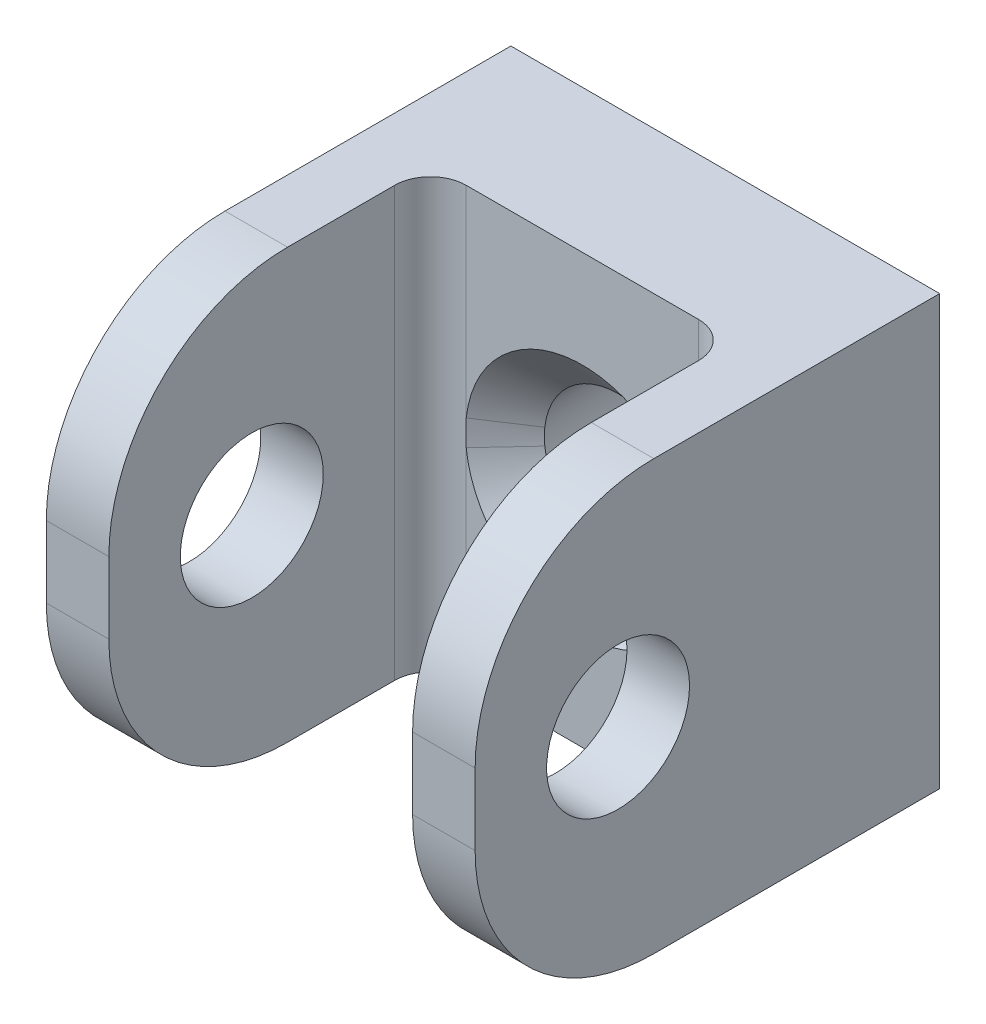
ISO-10303-21;
HEADER;
FILE_DESCRIPTION(('STEP AP214'),'2;1');
FILE_NAME('part.step','',(''),(''),'','','');
FILE_SCHEMA(('AUTOMOTIVE_DESIGN { 1 0 10303 214 1 1 1 1 }'));
ENDSEC;
DATA;
#1=APPLICATION_CONTEXT('core data for automotive mechanical design processes');
#2=APPLICATION_PROTOCOL_DEFINITION('international standard','automotive_design',2000,#1);
#3=PRODUCT_CONTEXT('',#1,'mechanical');
#4=PRODUCT('Part','Part','',(#3));
#5=PRODUCT_RELATED_PRODUCT_CATEGORY('part','',(#4));
#6=PRODUCT_DEFINITION_FORMATION('','',#4);
#7=PRODUCT_DEFINITION_CONTEXT('part definition',#1,'design');
#8=PRODUCT_DEFINITION('design','',#6,#7);
#9=PRODUCT_DEFINITION_SHAPE('','',#8);
#10=(LENGTH_UNIT() NAMED_UNIT(*) SI_UNIT(.MILLI.,.METRE.));
#11=(NAMED_UNIT(*) PLANE_ANGLE_UNIT() SI_UNIT($,.RADIAN.));
#12=(NAMED_UNIT(*) SI_UNIT($,.STERADIAN.) SOLID_ANGLE_UNIT());
#13=UNCERTAINTY_MEASURE_WITH_UNIT(LENGTH_MEASURE(1.E-05),#10,'distance_accuracy_value','');
#14=(GEOMETRIC_REPRESENTATION_CONTEXT(3) GLOBAL_UNCERTAINTY_ASSIGNED_CONTEXT((#13)) GLOBAL_UNIT_ASSIGNED_CONTEXT((#10,
#11,#12)) REPRESENTATION_CONTEXT('',''));
#15=CARTESIAN_POINT('',(0.,0.,0.));
#16=DIRECTION('',(0.,0.,1.));
#17=DIRECTION('',(1.,0.,0.));
#18=AXIS2_PLACEMENT_3D('',#15,#16,#17);
#19=CARTESIAN_POINT('',(0.,0.,-16.));
#20=DIRECTION('',(0.,0.,-1.));
#21=DIRECTION('',(-1.,0.,0.));
#22=AXIS2_PLACEMENT_3D('',#19,#20,#21);
#23=PLANE('',#22);
#24=DIRECTION('',(0.,-1.,0.));
#25=VECTOR('',#24,1.);
#26=CARTESIAN_POINT('',(3.25,6.,-16.));
#27=LINE('',#26,#25);
#28=CARTESIAN_POINT('',(3.25,-6.,-16.));
#29=VERTEX_POINT('',#28);
#30=CARTESIAN_POINT('',(3.25,-0.361109401705414,-16.));
#31=VERTEX_POINT('',#30);
#32=EDGE_CURVE('E336',#29,#31,#27,.F.);
#33=ORIENTED_EDGE('',*,*,#32,.T.);
#34=CARTESIAN_POINT('',(0.,0.,-16.));
#35=DIRECTION('',(0.,0.,-1.));
#36=DIRECTION('',(-1.,0.,0.));
#37=AXIS2_PLACEMENT_3D('',#34,#35,#36);
#38=CIRCLE('',#37,3.27000000000001);
#39=CARTESIAN_POINT('',(-3.25,-0.361109401705414,-16.));
#40=VERTEX_POINT('',#39);
#41=EDGE_CURVE('E69',#31,#40,#38,.T.);
#42=ORIENTED_EDGE('',*,*,#41,.T.);
#43=DIRECTION('',(0.,-1.,0.));
#44=VECTOR('',#43,1.);
#45=CARTESIAN_POINT('',(-3.25,-6.,-16.));
#46=LINE('',#45,#44);
#47=CARTESIAN_POINT('',(-3.25,-6.,-16.));
#48=VERTEX_POINT('',#47);
#49=EDGE_CURVE('E321',#40,#48,#46,.T.);
#50=ORIENTED_EDGE('',*,*,#49,.T.);
#51=DIRECTION('',(1.,0.,0.));
#52=VECTOR('',#51,1.);
#53=CARTESIAN_POINT('',(0.,-6.,-16.));
#54=LINE('',#53,#52);
#55=EDGE_CURVE('E275',#48,#29,#54,.T.);
#56=ORIENTED_EDGE('',*,*,#55,.T.);
#57=EDGE_LOOP('',(#33,#42,#50,#56));
#58=FACE_BOUND('',#57,.T.);
#59=ADVANCED_FACE('F47',(#58),#23,.F.);
#60=CARTESIAN_POINT('',(-3.25,6.,-16.));
#61=VERTEX_POINT('',#60);
#62=CARTESIAN_POINT('',(-3.25,0.361109401705414,-16.));
#63=VERTEX_POINT('',#62);
#64=EDGE_CURVE('E330',#61,#63,#46,.T.);
#65=ORIENTED_EDGE('',*,*,#64,.T.);
#66=CARTESIAN_POINT('',(0.,0.,-16.));
#67=DIRECTION('',(0.,0.,-1.));
#68=DIRECTION('',(-1.,0.,0.));
#69=AXIS2_PLACEMENT_3D('',#66,#67,#68);
#70=CIRCLE('',#69,3.27000000000001);
#71=CARTESIAN_POINT('',(3.25,0.361109401705414,-16.));
#72=VERTEX_POINT('',#71);
#73=EDGE_CURVE('E386',#63,#72,#70,.T.);
#74=ORIENTED_EDGE('',*,*,#73,.T.);
#75=CARTESIAN_POINT('',(3.25,6.,-16.));
#76=VERTEX_POINT('',#75);
#77=EDGE_CURVE('E333',#72,#76,#27,.F.);
#78=ORIENTED_EDGE('',*,*,#77,.T.);
#79=DIRECTION('',(-1.,0.,0.));
#80=VECTOR('',#79,1.);
#81=CARTESIAN_POINT('',(0.,6.,-16.));
#82=LINE('',#81,#80);
#83=EDGE_CURVE('E271',#76,#61,#82,.T.);
#84=ORIENTED_EDGE('',*,*,#83,.T.);
#85=EDGE_LOOP('',(#65,#74,#78,#84));
#86=FACE_BOUND('',#85,.T.);
#87=ADVANCED_FACE('F519',(#86),#23,.F.);
#88=CARTESIAN_POINT('',(6.,-6.,-16.));
#89=DIRECTION('',(-1.,0.,0.));
#90=DIRECTION('',(0.,0.,1.));
#91=AXIS2_PLACEMENT_3D('',#88,#89,#90);
#92=PLANE('',#91);
#93=CARTESIAN_POINT('',(6.,0.,-11.));
#94=DIRECTION('',(-1.,0.,0.));
#95=DIRECTION('',(0.,0.,1.));
#96=AXIS2_PLACEMENT_3D('',#93,#94,#95);
#97=CIRCLE('',#96,2.);
#98=CARTESIAN_POINT('',(6.,0.,-13.));
#99=VERTEX_POINT('',#98);
#100=EDGE_CURVE('E244',#99,#99,#97,.F.);
#101=ORIENTED_EDGE('',*,*,#100,.F.);
#102=EDGE_LOOP('',(#101));
#103=FACE_BOUND('',#102,.T.);
#104=DIRECTION('',(0.,1.,0.));
#105=VECTOR('',#104,1.);
#106=CARTESIAN_POINT('',(6.,-6.,-7.));
#107=LINE('',#106,#105);
#108=CARTESIAN_POINT('',(6.,-1.,-7.));
#109=VERTEX_POINT('',#108);
#110=CARTESIAN_POINT('',(6.,1.,-7.));
#111=VERTEX_POINT('',#110);
#112=EDGE_CURVE('E255',#109,#111,#107,.T.);
#113=ORIENTED_EDGE('',*,*,#112,.F.);
#114=CARTESIAN_POINT('',(6.,-1.,-12.));
#115=DIRECTION('',(-1.,0.,0.));
#116=DIRECTION('',(0.,0.,1.));
#117=AXIS2_PLACEMENT_3D('',#114,#115,#116);
#118=CIRCLE('',#117,5.);
#119=CARTESIAN_POINT('',(6.,-6.,-12.));
#120=VERTEX_POINT('',#119);
#121=EDGE_CURVE('E299',#109,#120,#118,.F.);
#122=ORIENTED_EDGE('',*,*,#121,.T.);
#123=DIRECTION('',(0.,0.,-1.));
#124=VECTOR('',#123,1.);
#125=CARTESIAN_POINT('',(6.,-6.,-16.));
#126=LINE('',#125,#124);
#127=CARTESIAN_POINT('',(6.,-6.,-20.));
#128=VERTEX_POINT('',#127);
#129=EDGE_CURVE('E279',#120,#128,#126,.T.);
#130=ORIENTED_EDGE('',*,*,#129,.T.);
#131=DIRECTION('',(0.,1.,0.));
#132=VECTOR('',#131,1.);
#133=CARTESIAN_POINT('',(6.,-6.,-20.));
#134=LINE('',#133,#132);
#135=CARTESIAN_POINT('',(6.,6.,-20.));
#136=VERTEX_POINT('',#135);
#137=EDGE_CURVE('E196',#128,#136,#134,.T.);
#138=ORIENTED_EDGE('',*,*,#137,.T.);
#139=DIRECTION('',(0.,0.,-1.));
#140=VECTOR('',#139,1.);
#141=CARTESIAN_POINT('',(6.,6.,-16.));
#142=LINE('',#141,#140);
#143=CARTESIAN_POINT('',(6.,6.,-12.));
#144=VERTEX_POINT('',#143);
#145=EDGE_CURVE('E190',#144,#136,#142,.T.);
#146=ORIENTED_EDGE('',*,*,#145,.F.);
#147=CARTESIAN_POINT('',(6.,1.,-12.));
#148=DIRECTION('',(-1.,0.,0.));
#149=DIRECTION('',(0.,0.,1.));
#150=AXIS2_PLACEMENT_3D('',#147,#148,#149);
#151=CIRCLE('',#150,5.);
#152=EDGE_CURVE('E296',#144,#111,#151,.F.);
#153=ORIENTED_EDGE('',*,*,#152,.T.);
#154=EDGE_LOOP('',(#113,#122,#130,#138,#146,#153));
#155=FACE_BOUND('',#154,.T.);
#156=ADVANCED_FACE('F525',(#103,#155),#92,.F.);
#157=CARTESIAN_POINT('',(0.,6.,-16.));
#158=DIRECTION('',(0.,-1.,0.));
#159=DIRECTION('',(0.,0.,-1.));
#160=AXIS2_PLACEMENT_3D('',#157,#158,#159);
#161=PLANE('',#160);
#162=DIRECTION('',(0.,0.,-1.));
#163=VECTOR('',#162,1.);
#164=CARTESIAN_POINT('',(4.25,6.,-7.));
#165=LINE('',#164,#163);
#166=CARTESIAN_POINT('',(4.25,6.,-12.));
#167=VERTEX_POINT('',#166);
#168=CARTESIAN_POINT('',(4.25,6.,-15.));
#169=VERTEX_POINT('',#168);
#170=EDGE_CURVE('E267',#167,#169,#165,.T.);
#171=ORIENTED_EDGE('',*,*,#170,.F.);
#172=DIRECTION('',(-1.,0.,0.));
#173=VECTOR('',#172,1.);
#174=CARTESIAN_POINT('',(6.,6.,-12.));
#175=LINE('',#174,#173);
#176=EDGE_CURVE('E311',#167,#144,#175,.F.);
#177=ORIENTED_EDGE('',*,*,#176,.T.);
#178=ORIENTED_EDGE('',*,*,#145,.T.);
#179=DIRECTION('',(-1.,0.,0.));
#180=VECTOR('',#179,1.);
#181=CARTESIAN_POINT('',(0.,6.,-20.));
#182=LINE('',#181,#180);
#183=CARTESIAN_POINT('',(-6.,6.,-20.));
#184=VERTEX_POINT('',#183);
#185=EDGE_CURVE('E181',#136,#184,#182,.T.);
#186=ORIENTED_EDGE('',*,*,#185,.T.);
#187=DIRECTION('',(0.,0.,-1.));
#188=VECTOR('',#187,1.);
#189=CARTESIAN_POINT('',(-6.,6.,-16.));
#190=LINE('',#189,#188);
#191=CARTESIAN_POINT('',(-6.,6.,-12.));
#192=VERTEX_POINT('',#191);
#193=EDGE_CURVE('E187',#192,#184,#190,.T.);
#194=ORIENTED_EDGE('',*,*,#193,.F.);
#195=DIRECTION('',(1.,0.,0.));
#196=VECTOR('',#195,1.);
#197=CARTESIAN_POINT('',(-6.,6.,-12.));
#198=LINE('',#197,#196);
#199=CARTESIAN_POINT('',(-4.25,6.,-12.));
#200=VERTEX_POINT('',#199);
#201=EDGE_CURVE('E241',#200,#192,#198,.F.);
#202=ORIENTED_EDGE('',*,*,#201,.F.);
#203=DIRECTION('',(0.,0.,-1.));
#204=VECTOR('',#203,1.);
#205=CARTESIAN_POINT('',(-4.25,6.,-7.));
#206=LINE('',#205,#204);
#207=CARTESIAN_POINT('',(-4.25,6.,-15.));
#208=VERTEX_POINT('',#207);
#209=EDGE_CURVE('E207',#200,#208,#206,.T.);
#210=ORIENTED_EDGE('',*,*,#209,.T.);
#211=CARTESIAN_POINT('',(-3.25,6.,-15.));
#212=DIRECTION('',(0.,-1.,0.));
#213=DIRECTION('',(0.,0.,-1.));
#214=AXIS2_PLACEMENT_3D('',#211,#212,#213);
#215=CIRCLE('',#214,1.);
#216=EDGE_CURVE('E375',#208,#61,#215,.T.);
#217=ORIENTED_EDGE('',*,*,#216,.T.);
#218=ORIENTED_EDGE('',*,*,#83,.F.);
#219=CARTESIAN_POINT('',(3.25,6.,-15.));
#220=DIRECTION('',(0.,-1.,0.));
#221=DIRECTION('',(0.,0.,-1.));
#222=AXIS2_PLACEMENT_3D('',#219,#220,#221);
#223=CIRCLE('',#222,1.);
#224=EDGE_CURVE('E584',#76,#169,#223,.T.);
#225=ORIENTED_EDGE('',*,*,#224,.T.);
#226=EDGE_LOOP('',(#171,#177,#178,#186,#194,#202,#210,#217,#218,#225));
#227=FACE_BOUND('',#226,.T.);
#228=ADVANCED_FACE('F184',(#227),#161,.F.);
#229=CARTESIAN_POINT('',(0.,-6.,-16.));
#230=DIRECTION('',(0.,1.,0.));
#231=DIRECTION('',(0.,0.,1.));
#232=AXIS2_PLACEMENT_3D('',#229,#230,#231);
#233=PLANE('',#232);
#234=ORIENTED_EDGE('',*,*,#129,.F.);
#235=DIRECTION('',(1.,0.,0.));
#236=VECTOR('',#235,1.);
#237=CARTESIAN_POINT('',(4.25,-6.,-12.));
#238=LINE('',#237,#236);
#239=CARTESIAN_POINT('',(4.25,-6.,-12.));
#240=VERTEX_POINT('',#239);
#241=EDGE_CURVE('E302',#120,#240,#238,.F.);
#242=ORIENTED_EDGE('',*,*,#241,.T.);
#243=DIRECTION('',(0.,0.,-1.));
#244=VECTOR('',#243,1.);
#245=CARTESIAN_POINT('',(4.25,-6.,-7.));
#246=LINE('',#245,#244);
#247=CARTESIAN_POINT('',(4.25,-6.,-15.));
#248=VERTEX_POINT('',#247);
#249=EDGE_CURVE('E263',#240,#248,#246,.T.);
#250=ORIENTED_EDGE('',*,*,#249,.T.);
#251=CARTESIAN_POINT('',(3.25,-6.,-15.));
#252=DIRECTION('',(0.,1.,0.));
#253=DIRECTION('',(0.,0.,1.));
#254=AXIS2_PLACEMENT_3D('',#251,#252,#253);
#255=CIRCLE('',#254,1.);
#256=EDGE_CURVE('E619',#248,#29,#255,.T.);
#257=ORIENTED_EDGE('',*,*,#256,.T.);
#258=ORIENTED_EDGE('',*,*,#55,.F.);
#259=CARTESIAN_POINT('',(-3.25,-6.,-15.));
#260=DIRECTION('',(0.,1.,0.));
#261=DIRECTION('',(0.,0.,1.));
#262=AXIS2_PLACEMENT_3D('',#259,#260,#261);
#263=CIRCLE('',#262,1.);
#264=CARTESIAN_POINT('',(-4.25,-6.,-15.));
#265=VERTEX_POINT('',#264);
#266=EDGE_CURVE('E613',#48,#265,#263,.T.);
#267=ORIENTED_EDGE('',*,*,#266,.T.);
#268=DIRECTION('',(0.,0.,-1.));
#269=VECTOR('',#268,1.);
#270=CARTESIAN_POINT('',(-4.25,-6.,-7.));
#271=LINE('',#270,#269);
#272=CARTESIAN_POINT('',(-4.25,-6.,-12.));
#273=VERTEX_POINT('',#272);
#274=EDGE_CURVE('E599',#273,#265,#271,.T.);
#275=ORIENTED_EDGE('',*,*,#274,.F.);
#276=DIRECTION('',(-1.,0.,0.));
#277=VECTOR('',#276,1.);
#278=CARTESIAN_POINT('',(-4.25,-6.,-12.));
#279=LINE('',#278,#277);
#280=CARTESIAN_POINT('',(-6.,-6.,-12.));
#281=VERTEX_POINT('',#280);
#282=EDGE_CURVE('E230',#281,#273,#279,.F.);
#283=ORIENTED_EDGE('',*,*,#282,.F.);
#284=DIRECTION('',(0.,0.,-1.));
#285=VECTOR('',#284,1.);
#286=CARTESIAN_POINT('',(-6.,-6.,-16.));
#287=LINE('',#286,#285);
#288=CARTESIAN_POINT('',(-6.,-6.,-20.));
#289=VERTEX_POINT('',#288);
#290=EDGE_CURVE('E206',#281,#289,#287,.T.);
#291=ORIENTED_EDGE('',*,*,#290,.T.);
#292=DIRECTION('',(1.,0.,0.));
#293=VECTOR('',#292,1.);
#294=CARTESIAN_POINT('',(0.,-6.,-20.));
#295=LINE('',#294,#293);
#296=EDGE_CURVE('E195',#289,#128,#295,.T.);
#297=ORIENTED_EDGE('',*,*,#296,.T.);
#298=EDGE_LOOP('',(#234,#242,#250,#257,#258,#267,#275,#283,#291,#297));
#299=FACE_BOUND('',#298,.T.);
#300=ADVANCED_FACE('F532',(#299),#233,.F.);
#301=CARTESIAN_POINT('',(0.,0.,-20.));
#302=DIRECTION('',(0.,0.,-1.));
#303=DIRECTION('',(-1.,0.,0.));
#304=AXIS2_PLACEMENT_3D('',#301,#302,#303);
#305=PLANE('',#304);
#306=CARTESIAN_POINT('',(0.,0.,-20.));
#307=DIRECTION('',(0.,0.,-1.));
#308=DIRECTION('',(-1.,0.,0.));
#309=AXIS2_PLACEMENT_3D('',#306,#307,#308);
#310=CIRCLE('',#309,2.07);
#311=CARTESIAN_POINT('',(-2.07,0.,-20.));
#312=VERTEX_POINT('',#311);
#313=EDGE_CURVE('E401',#312,#312,#310,.T.);
#314=ORIENTED_EDGE('',*,*,#313,.F.);
#315=EDGE_LOOP('',(#314));
#316=FACE_BOUND('',#315,.T.);
#317=ORIENTED_EDGE('',*,*,#137,.F.);
#318=ORIENTED_EDGE('',*,*,#296,.F.);
#319=DIRECTION('',(0.,1.,0.));
#320=VECTOR('',#319,1.);
#321=CARTESIAN_POINT('',(-6.,-6.,-20.));
#322=LINE('',#321,#320);
#323=EDGE_CURVE('E199',#289,#184,#322,.T.);
#324=ORIENTED_EDGE('',*,*,#323,.T.);
#325=ORIENTED_EDGE('',*,*,#185,.F.);
#326=EDGE_LOOP('',(#317,#318,#324,#325));
#327=FACE_BOUND('',#326,.T.);
#328=ADVANCED_FACE('F200',(#316,#327),#305,.T.);
#329=CARTESIAN_POINT('',(4.25,-6.,-7.));
#330=DIRECTION('',(1.,0.,0.));
#331=DIRECTION('',(0.,0.,-1.));
#332=AXIS2_PLACEMENT_3D('',#329,#330,#331);
#333=PLANE('',#332);
#334=CARTESIAN_POINT('',(4.25,0.,-11.));
#335=DIRECTION('',(1.,0.,0.));
#336=DIRECTION('',(0.,0.,-1.));
#337=AXIS2_PLACEMENT_3D('',#334,#335,#336);
#338=CIRCLE('',#337,2.);
#339=CARTESIAN_POINT('',(4.25,0.,-13.));
#340=VERTEX_POINT('',#339);
#341=EDGE_CURVE('E254',#340,#340,#338,.F.);
#342=ORIENTED_EDGE('',*,*,#341,.F.);
#343=EDGE_LOOP('',(#342));
#344=FACE_BOUND('',#343,.T.);
#345=ORIENTED_EDGE('',*,*,#170,.T.);
#346=DIRECTION('',(0.,-1.,0.));
#347=VECTOR('',#346,1.);
#348=CARTESIAN_POINT('',(4.25,-6.,-15.));
#349=LINE('',#348,#347);
#350=EDGE_CURVE('E314',#169,#248,#349,.T.);
#351=ORIENTED_EDGE('',*,*,#350,.T.);
#352=ORIENTED_EDGE('',*,*,#249,.F.);
#353=CARTESIAN_POINT('',(4.25,-1.,-12.));
#354=DIRECTION('',(1.,0.,0.));
#355=DIRECTION('',(0.,0.,-1.));
#356=AXIS2_PLACEMENT_3D('',#353,#354,#355);
#357=CIRCLE('',#356,5.);
#358=CARTESIAN_POINT('',(4.25,-1.,-7.));
#359=VERTEX_POINT('',#358);
#360=EDGE_CURVE('E308',#240,#359,#357,.F.);
#361=ORIENTED_EDGE('',*,*,#360,.T.);
#362=DIRECTION('',(0.,-1.,0.));
#363=VECTOR('',#362,1.);
#364=CARTESIAN_POINT('',(4.25,-6.,-7.));
#365=LINE('',#364,#363);
#366=CARTESIAN_POINT('',(4.25,1.,-7.));
#367=VERTEX_POINT('',#366);
#368=EDGE_CURVE('E259',#367,#359,#365,.T.);
#369=ORIENTED_EDGE('',*,*,#368,.F.);
#370=CARTESIAN_POINT('',(4.25,1.,-12.));
#371=DIRECTION('',(1.,0.,0.));
#372=DIRECTION('',(0.,0.,-1.));
#373=AXIS2_PLACEMENT_3D('',#370,#371,#372);
#374=CIRCLE('',#373,5.);
#375=EDGE_CURVE('E305',#367,#167,#374,.F.);
#376=ORIENTED_EDGE('',*,*,#375,.T.);
#377=EDGE_LOOP('',(#345,#351,#352,#361,#369,#376));
#378=FACE_BOUND('',#377,.T.);
#379=ADVANCED_FACE('F529',(#344,#378),#333,.F.);
#380=CARTESIAN_POINT('',(0.,0.,-7.));
#381=DIRECTION('',(0.,0.,1.));
#382=DIRECTION('',(1.,0.,0.));
#383=AXIS2_PLACEMENT_3D('',#380,#381,#382);
#384=PLANE('',#383);
#385=ORIENTED_EDGE('',*,*,#368,.T.);
#386=DIRECTION('',(1.,0.,0.));
#387=VECTOR('',#386,1.);
#388=CARTESIAN_POINT('',(6.,-1.,-7.));
#389=LINE('',#388,#387);
#390=EDGE_CURVE('E292',#359,#109,#389,.T.);
#391=ORIENTED_EDGE('',*,*,#390,.T.);
#392=ORIENTED_EDGE('',*,*,#112,.T.);
#393=DIRECTION('',(-1.,0.,0.));
#394=VECTOR('',#393,1.);
#395=CARTESIAN_POINT('',(4.25,1.,-7.));
#396=LINE('',#395,#394);
#397=EDGE_CURVE('E288',#111,#367,#396,.T.);
#398=ORIENTED_EDGE('',*,*,#397,.T.);
#399=EDGE_LOOP('',(#385,#391,#392,#398));
#400=FACE_BOUND('',#399,.T.);
#401=ADVANCED_FACE('F546',(#400),#384,.T.);
#402=CARTESIAN_POINT('',(0.,-1.,-12.));
#403=DIRECTION('',(-1.,0.,0.));
#404=DIRECTION('',(0.,0.,1.));
#405=AXIS2_PLACEMENT_3D('',#402,#403,#404);
#406=CYLINDRICAL_SURFACE('',#405,5.);
#407=ORIENTED_EDGE('',*,*,#360,.F.);
#408=ORIENTED_EDGE('',*,*,#241,.F.);
#409=ORIENTED_EDGE('',*,*,#121,.F.);
#410=ORIENTED_EDGE('',*,*,#390,.F.);
#411=EDGE_LOOP('',(#407,#408,#409,#410));
#412=FACE_BOUND('',#411,.T.);
#413=ADVANCED_FACE('F542',(#412),#406,.T.);
#414=CARTESIAN_POINT('',(0.,1.,-12.));
#415=DIRECTION('',(1.,0.,0.));
#416=DIRECTION('',(0.,0.,-1.));
#417=AXIS2_PLACEMENT_3D('',#414,#415,#416);
#418=CYLINDRICAL_SURFACE('',#417,5.);
#419=ORIENTED_EDGE('',*,*,#152,.F.);
#420=ORIENTED_EDGE('',*,*,#176,.F.);
#421=ORIENTED_EDGE('',*,*,#375,.F.);
#422=ORIENTED_EDGE('',*,*,#397,.F.);
#423=EDGE_LOOP('',(#419,#420,#421,#422));
#424=FACE_BOUND('',#423,.T.);
#425=ADVANCED_FACE('F545',(#424),#418,.T.);
#426=CARTESIAN_POINT('',(-10.,0.,-11.));
#427=DIRECTION('',(1.,0.,0.));
#428=DIRECTION('',(0.,0.,-1.));
#429=AXIS2_PLACEMENT_3D('',#426,#427,#428);
#430=CYLINDRICAL_SURFACE('',#429,2.);
#431=CARTESIAN_POINT('',(6.,0.,-13.));
#432=CARTESIAN_POINT('',(5.98177083333334,0.,-13.));
#433=CARTESIAN_POINT('',(5.96354166666667,0.,-13.));
#434=CARTESIAN_POINT('',(5.92708333333334,0.,-13.));
#435=CARTESIAN_POINT('',(5.90885416666667,0.,-13.));
#436=CARTESIAN_POINT('',(5.87239583333334,0.,-13.));
#437=CARTESIAN_POINT('',(5.85416666666667,0.,-13.));
#438=CARTESIAN_POINT('',(5.81770833333334,0.,-13.));
#439=CARTESIAN_POINT('',(5.79947916666667,0.,-13.));
#440=CARTESIAN_POINT('',(5.76302083333334,0.,-13.));
#441=CARTESIAN_POINT('',(5.74479166666667,0.,-13.));
#442=CARTESIAN_POINT('',(5.70833333333333,0.,-13.));
#443=CARTESIAN_POINT('',(5.69010416666667,0.,-13.));
#444=CARTESIAN_POINT('',(5.65364583333334,0.,-13.));
#445=CARTESIAN_POINT('',(5.63541666666667,0.,-13.));
#446=CARTESIAN_POINT('',(5.59895833333334,0.,-13.));
#447=CARTESIAN_POINT('',(5.58072916666667,0.,-13.));
#448=CARTESIAN_POINT('',(5.54427083333334,0.,-13.));
#449=CARTESIAN_POINT('',(5.52604166666667,0.,-13.));
#450=CARTESIAN_POINT('',(5.48958333333334,0.,-13.));
#451=CARTESIAN_POINT('',(5.47135416666667,0.,-13.));
#452=CARTESIAN_POINT('',(5.43489583333334,0.,-13.));
#453=CARTESIAN_POINT('',(5.41666666666667,0.,-13.));
#454=CARTESIAN_POINT('',(5.38020833333334,0.,-13.));
#455=CARTESIAN_POINT('',(5.36197916666667,0.,-13.));
#456=CARTESIAN_POINT('',(5.32552083333334,0.,-13.));
#457=CARTESIAN_POINT('',(5.30729166666667,0.,-13.));
#458=CARTESIAN_POINT('',(5.27083333333334,0.,-13.));
#459=CARTESIAN_POINT('',(5.25260416666667,0.,-13.));
#460=CARTESIAN_POINT('',(5.21614583333334,0.,-13.));
#461=CARTESIAN_POINT('',(5.19791666666667,0.,-13.));
#462=CARTESIAN_POINT('',(5.16145833333334,0.,-13.));
#463=CARTESIAN_POINT('',(5.14322916666667,0.,-13.));
#464=CARTESIAN_POINT('',(5.10677083333334,0.,-13.));
#465=CARTESIAN_POINT('',(5.08854166666667,0.,-13.));
#466=CARTESIAN_POINT('',(5.05208333333334,0.,-13.));
#467=CARTESIAN_POINT('',(5.03385416666667,0.,-13.));
#468=CARTESIAN_POINT('',(4.99739583333334,0.,-13.));
#469=CARTESIAN_POINT('',(4.97916666666667,0.,-13.));
#470=CARTESIAN_POINT('',(4.94270833333334,0.,-13.));
#471=CARTESIAN_POINT('',(4.92447916666667,0.,-13.));
#472=CARTESIAN_POINT('',(4.88802083333334,0.,-13.));
#473=CARTESIAN_POINT('',(4.86979166666667,0.,-13.));
#474=CARTESIAN_POINT('',(4.83333333333334,0.,-13.));
#475=CARTESIAN_POINT('',(4.81510416666667,0.,-13.));
#476=CARTESIAN_POINT('',(4.77864583333334,0.,-13.));
#477=CARTESIAN_POINT('',(4.76041666666667,0.,-13.));
#478=CARTESIAN_POINT('',(4.72395833333333,0.,-13.));
#479=CARTESIAN_POINT('',(4.70572916666667,0.,-13.));
#480=CARTESIAN_POINT('',(4.66927083333333,0.,-13.));
#481=CARTESIAN_POINT('',(4.65104166666667,0.,-13.));
#482=CARTESIAN_POINT('',(4.61458333333333,0.,-13.));
#483=CARTESIAN_POINT('',(4.59635416666667,0.,-13.));
#484=CARTESIAN_POINT('',(4.55989583333333,0.,-13.));
#485=CARTESIAN_POINT('',(4.54166666666667,0.,-13.));
#486=CARTESIAN_POINT('',(4.50520833333333,0.,-13.));
#487=CARTESIAN_POINT('',(4.48697916666667,0.,-13.));
#488=CARTESIAN_POINT('',(4.45052083333333,0.,-13.));
#489=CARTESIAN_POINT('',(4.43229166666667,0.,-13.));
#490=CARTESIAN_POINT('',(4.39583333333333,0.,-13.));
#491=CARTESIAN_POINT('',(4.37760416666667,0.,-13.));
#492=CARTESIAN_POINT('',(4.34114583333333,0.,-13.));
#493=CARTESIAN_POINT('',(4.32291666666667,0.,-13.));
#494=CARTESIAN_POINT('',(4.28645833333333,0.,-13.));
#495=CARTESIAN_POINT('',(4.26822916666667,0.,-13.));
#496=CARTESIAN_POINT('',(4.25,0.,-13.));
#497=B_SPLINE_CURVE_WITH_KNOTS('',3,(#431,#432,#433,#434,#435,#436,#437,#438,#439,#440,#441,
#442,#443,#444,#445,#446,#447,#448,#449,#450,#451,#452,#453,#454,#455,#456,#457,#458,#459,#460,
#461,#462,#463,#464,#465,#466,#467,#468,#469,#470,#471,#472,#473,#474,#475,#476,#477,#478,#479,
#480,#481,#482,#483,#484,#485,#486,#487,#488,#489,#490,#491,#492,#493,#494,#495,#496),
.UNSPECIFIED.,.F.,.F.,(4,2,2,2,2,2,2,2,2,2,2,2,2,2,2,2,2,2,2,2,2,2,2,2,2,2,2,2,2,2,2,2,4),(0.,
0.0546875000000009,0.109375000000002,0.164062499999999,0.21875,0.273437500000001,
0.328125000000002,0.382812499999999,0.437499999999999,0.4921875,0.546875,0.6015625,
0.656250000000001,0.7109375,0.765625000000001,0.8203125,0.875000000000001,0.929687500000002,
0.984375000000001,1.0390625,1.09375,1.1484375,1.203125,1.2578125,1.3125,1.3671875,1.421875,
1.4765625,1.53125,1.5859375,1.640625,1.6953125,1.75),.UNSPECIFIED.);
#498=EDGE_CURVE('BSEAM549',#99,#340,#497,.T.);
#499=ORIENTED_EDGE('',*,*,#100,.T.);
#500=ORIENTED_EDGE('',*,*,#341,.T.);
#501=ORIENTED_EDGE('',*,*,#498,.T.);
#502=ORIENTED_EDGE('',*,*,#498,.F.);
#503=EDGE_LOOP('',(#499,#501,#500,#502));
#504=FACE_BOUND('',#503,.T.);
#505=ADVANCED_FACE('F549',(#504),#430,.F.);
#506=CARTESIAN_POINT('',(-6.,-6.,-16.));
#507=DIRECTION('',(1.,0.,0.));
#508=DIRECTION('',(0.,0.,1.));
#509=AXIS2_PLACEMENT_3D('',#506,#507,#508);
#510=PLANE('',#509);
#511=CARTESIAN_POINT('',(-6.,0.,-11.));
#512=DIRECTION('',(-1.,0.,0.));
#513=DIRECTION('',(0.,0.,1.));
#514=AXIS2_PLACEMENT_3D('',#511,#512,#513);
#515=CIRCLE('',#514,2.);
#516=CARTESIAN_POINT('',(-6.,0.,-13.));
#517=VERTEX_POINT('',#516);
#518=EDGE_CURVE('E250',#517,#517,#515,.F.);
#519=ORIENTED_EDGE('',*,*,#518,.T.);
#520=EDGE_LOOP('',(#519));
#521=FACE_BOUND('',#520,.T.);
#522=DIRECTION('',(0.,1.,0.));
#523=VECTOR('',#522,1.);
#524=CARTESIAN_POINT('',(-6.,-6.,-7.));
#525=LINE('',#524,#523);
#526=CARTESIAN_POINT('',(-6.,-1.,-7.));
#527=VERTEX_POINT('',#526);
#528=CARTESIAN_POINT('',(-6.,1.,-7.));
#529=VERTEX_POINT('',#528);
#530=EDGE_CURVE('E249',#527,#529,#525,.T.);
#531=ORIENTED_EDGE('',*,*,#530,.T.);
#532=CARTESIAN_POINT('',(-6.,1.,-12.));
#533=DIRECTION('',(-1.,0.,0.));
#534=DIRECTION('',(0.,0.,1.));
#535=AXIS2_PLACEMENT_3D('',#532,#533,#534);
#536=CIRCLE('',#535,5.);
#537=EDGE_CURVE('E212',#192,#529,#536,.F.);
#538=ORIENTED_EDGE('',*,*,#537,.F.);
#539=ORIENTED_EDGE('',*,*,#193,.T.);
#540=ORIENTED_EDGE('',*,*,#323,.F.);
#541=ORIENTED_EDGE('',*,*,#290,.F.);
#542=CARTESIAN_POINT('',(-6.,-1.,-12.));
#543=DIRECTION('',(-1.,0.,0.));
#544=DIRECTION('',(0.,0.,1.));
#545=AXIS2_PLACEMENT_3D('',#542,#543,#544);
#546=CIRCLE('',#545,5.);
#547=EDGE_CURVE('E226',#527,#281,#546,.F.);
#548=ORIENTED_EDGE('',*,*,#547,.F.);
#549=EDGE_LOOP('',(#531,#538,#539,#540,#541,#548));
#550=FACE_BOUND('',#549,.T.);
#551=ADVANCED_FACE('F210',(#521,#550),#510,.F.);
#552=CARTESIAN_POINT('',(-4.25,-6.,-7.));
#553=DIRECTION('',(-1.,0.,0.));
#554=DIRECTION('',(0.,0.,-1.));
#555=AXIS2_PLACEMENT_3D('',#552,#553,#554);
#556=PLANE('',#555);
#557=CARTESIAN_POINT('',(-4.25,0.,-11.));
#558=DIRECTION('',(1.,0.,0.));
#559=DIRECTION('',(0.,0.,-1.));
#560=AXIS2_PLACEMENT_3D('',#557,#558,#559);
#561=CIRCLE('',#560,2.);
#562=CARTESIAN_POINT('',(-4.25,0.,-13.));
#563=VERTEX_POINT('',#562);
#564=EDGE_CURVE('E245',#563,#563,#561,.F.);
#565=ORIENTED_EDGE('',*,*,#564,.T.);
#566=EDGE_LOOP('',(#565));
#567=FACE_BOUND('',#566,.T.);
#568=ORIENTED_EDGE('',*,*,#274,.T.);
#569=DIRECTION('',(0.,-1.,0.));
#570=VECTOR('',#569,1.);
#571=CARTESIAN_POINT('',(-4.25,6.,-15.));
#572=LINE('',#571,#570);
#573=EDGE_CURVE('E339',#265,#208,#572,.F.);
#574=ORIENTED_EDGE('',*,*,#573,.T.);
#575=ORIENTED_EDGE('',*,*,#209,.F.);
#576=CARTESIAN_POINT('',(-4.25,1.,-12.));
#577=DIRECTION('',(1.,0.,0.));
#578=DIRECTION('',(0.,0.,-1.));
#579=AXIS2_PLACEMENT_3D('',#576,#577,#578);
#580=CIRCLE('',#579,5.);
#581=CARTESIAN_POINT('',(-4.25,1.,-7.));
#582=VERTEX_POINT('',#581);
#583=EDGE_CURVE('E234',#582,#200,#580,.F.);
#584=ORIENTED_EDGE('',*,*,#583,.F.);
#585=DIRECTION('',(0.,-1.,0.));
#586=VECTOR('',#585,1.);
#587=CARTESIAN_POINT('',(-4.25,-6.,-7.));
#588=LINE('',#587,#586);
#589=CARTESIAN_POINT('',(-4.25,-1.,-7.));
#590=VERTEX_POINT('',#589);
#591=EDGE_CURVE('E595',#582,#590,#588,.T.);
#592=ORIENTED_EDGE('',*,*,#591,.T.);
#593=CARTESIAN_POINT('',(-4.25,-1.,-12.));
#594=DIRECTION('',(1.,0.,0.));
#595=DIRECTION('',(0.,0.,-1.));
#596=AXIS2_PLACEMENT_3D('',#593,#594,#595);
#597=CIRCLE('',#596,5.);
#598=EDGE_CURVE('E237',#273,#590,#597,.F.);
#599=ORIENTED_EDGE('',*,*,#598,.F.);
#600=EDGE_LOOP('',(#568,#574,#575,#584,#592,#599));
#601=FACE_BOUND('',#600,.T.);
#602=ADVANCED_FACE('F622',(#567,#601),#556,.F.);
#603=CARTESIAN_POINT('',(0.,0.,-7.));
#604=DIRECTION('',(0.,0.,1.));
#605=DIRECTION('',(-1.,0.,0.));
#606=AXIS2_PLACEMENT_3D('',#603,#604,#605);
#607=PLANE('',#606);
#608=ORIENTED_EDGE('',*,*,#591,.F.);
#609=DIRECTION('',(1.,0.,0.));
#610=VECTOR('',#609,1.);
#611=CARTESIAN_POINT('',(-4.25,1.,-7.));
#612=LINE('',#611,#610);
#613=EDGE_CURVE('E214',#529,#582,#612,.T.);
#614=ORIENTED_EDGE('',*,*,#613,.F.);
#615=ORIENTED_EDGE('',*,*,#530,.F.);
#616=DIRECTION('',(-1.,0.,0.));
#617=VECTOR('',#616,1.);
#618=CARTESIAN_POINT('',(-6.,-1.,-7.));
#619=LINE('',#618,#617);
#620=EDGE_CURVE('E218',#590,#527,#619,.T.);
#621=ORIENTED_EDGE('',*,*,#620,.F.);
#622=EDGE_LOOP('',(#608,#614,#615,#621));
#623=FACE_BOUND('',#622,.T.);
#624=ADVANCED_FACE('F644',(#623),#607,.T.);
#625=CARTESIAN_POINT('',(0.,-1.,-12.));
#626=DIRECTION('',(1.,0.,0.));
#627=DIRECTION('',(0.,0.,1.));
#628=AXIS2_PLACEMENT_3D('',#625,#626,#627);
#629=CYLINDRICAL_SURFACE('',#628,5.);
#630=ORIENTED_EDGE('',*,*,#598,.T.);
#631=ORIENTED_EDGE('',*,*,#620,.T.);
#632=ORIENTED_EDGE('',*,*,#547,.T.);
#633=ORIENTED_EDGE('',*,*,#282,.T.);
#634=EDGE_LOOP('',(#630,#631,#632,#633));
#635=FACE_BOUND('',#634,.T.);
#636=ADVANCED_FACE('F648',(#635),#629,.T.);
#637=CARTESIAN_POINT('',(0.,1.,-12.));
#638=DIRECTION('',(-1.,0.,0.));
#639=DIRECTION('',(0.,0.,-1.));
#640=AXIS2_PLACEMENT_3D('',#637,#638,#639);
#641=CYLINDRICAL_SURFACE('',#640,5.);
#642=ORIENTED_EDGE('',*,*,#537,.T.);
#643=ORIENTED_EDGE('',*,*,#613,.T.);
#644=ORIENTED_EDGE('',*,*,#583,.T.);
#645=ORIENTED_EDGE('',*,*,#201,.T.);
#646=EDGE_LOOP('',(#642,#643,#644,#645));
#647=FACE_BOUND('',#646,.T.);
#648=ADVANCED_FACE('F646',(#647),#641,.T.);
#649=CARTESIAN_POINT('',(10.,0.,-11.));
#650=DIRECTION('',(-1.,0.,0.));
#651=DIRECTION('',(0.,0.,-1.));
#652=AXIS2_PLACEMENT_3D('',#649,#650,#651);
#653=CYLINDRICAL_SURFACE('',#652,2.);
#654=CARTESIAN_POINT('',(-6.,0.,-13.));
#655=CARTESIAN_POINT('',(-5.98177083333333,0.,-13.));
#656=CARTESIAN_POINT('',(-5.96354166666666,0.,-13.));
#657=CARTESIAN_POINT('',(-5.92708333333333,0.,-13.));
#658=CARTESIAN_POINT('',(-5.90885416666666,0.,-13.));
#659=CARTESIAN_POINT('',(-5.87239583333333,0.,-13.));
#660=CARTESIAN_POINT('',(-5.85416666666666,0.,-13.));
#661=CARTESIAN_POINT('',(-5.81770833333333,0.,-13.));
#662=CARTESIAN_POINT('',(-5.79947916666666,0.,-13.));
#663=CARTESIAN_POINT('',(-5.76302083333333,0.,-13.));
#664=CARTESIAN_POINT('',(-5.74479166666666,0.,-13.));
#665=CARTESIAN_POINT('',(-5.70833333333333,0.,-13.));
#666=CARTESIAN_POINT('',(-5.69010416666666,0.,-13.));
#667=CARTESIAN_POINT('',(-5.65364583333333,0.,-13.));
#668=CARTESIAN_POINT('',(-5.63541666666667,0.,-13.));
#669=CARTESIAN_POINT('',(-5.59895833333333,0.,-13.));
#670=CARTESIAN_POINT('',(-5.58072916666667,0.,-13.));
#671=CARTESIAN_POINT('',(-5.54427083333333,0.,-13.));
#672=CARTESIAN_POINT('',(-5.52604166666667,0.,-13.));
#673=CARTESIAN_POINT('',(-5.48958333333333,0.,-13.));
#674=CARTESIAN_POINT('',(-5.47135416666667,0.,-13.));
#675=CARTESIAN_POINT('',(-5.43489583333333,0.,-13.));
#676=CARTESIAN_POINT('',(-5.41666666666667,0.,-13.));
#677=CARTESIAN_POINT('',(-5.38020833333333,0.,-13.));
#678=CARTESIAN_POINT('',(-5.36197916666667,0.,-13.));
#679=CARTESIAN_POINT('',(-5.32552083333333,0.,-13.));
#680=CARTESIAN_POINT('',(-5.30729166666667,0.,-13.));
#681=CARTESIAN_POINT('',(-5.27083333333333,0.,-13.));
#682=CARTESIAN_POINT('',(-5.25260416666667,0.,-13.));
#683=CARTESIAN_POINT('',(-5.21614583333333,0.,-13.));
#684=CARTESIAN_POINT('',(-5.19791666666667,0.,-13.));
#685=CARTESIAN_POINT('',(-5.16145833333333,0.,-13.));
#686=CARTESIAN_POINT('',(-5.14322916666667,0.,-13.));
#687=CARTESIAN_POINT('',(-5.10677083333333,0.,-13.));
#688=CARTESIAN_POINT('',(-5.08854166666667,0.,-13.));
#689=CARTESIAN_POINT('',(-5.05208333333333,0.,-13.));
#690=CARTESIAN_POINT('',(-5.03385416666667,0.,-13.));
#691=CARTESIAN_POINT('',(-4.99739583333333,0.,-13.));
#692=CARTESIAN_POINT('',(-4.97916666666667,0.,-13.));
#693=CARTESIAN_POINT('',(-4.94270833333333,0.,-13.));
#694=CARTESIAN_POINT('',(-4.92447916666667,0.,-13.));
#695=CARTESIAN_POINT('',(-4.88802083333333,0.,-13.));
#696=CARTESIAN_POINT('',(-4.86979166666667,0.,-13.));
#697=CARTESIAN_POINT('',(-4.83333333333333,0.,-13.));
#698=CARTESIAN_POINT('',(-4.81510416666667,0.,-13.));
#699=CARTESIAN_POINT('',(-4.77864583333333,0.,-13.));
#700=CARTESIAN_POINT('',(-4.76041666666667,0.,-13.));
#701=CARTESIAN_POINT('',(-4.72395833333333,0.,-13.));
#702=CARTESIAN_POINT('',(-4.70572916666667,0.,-13.));
#703=CARTESIAN_POINT('',(-4.66927083333333,0.,-13.));
#704=CARTESIAN_POINT('',(-4.65104166666667,0.,-13.));
#705=CARTESIAN_POINT('',(-4.61458333333333,0.,-13.));
#706=CARTESIAN_POINT('',(-4.59635416666667,0.,-13.));
#707=CARTESIAN_POINT('',(-4.55989583333333,0.,-13.));
#708=CARTESIAN_POINT('',(-4.54166666666667,0.,-13.));
#709=CARTESIAN_POINT('',(-4.50520833333333,0.,-13.));
#710=CARTESIAN_POINT('',(-4.48697916666667,0.,-13.));
#711=CARTESIAN_POINT('',(-4.45052083333333,0.,-13.));
#712=CARTESIAN_POINT('',(-4.43229166666667,0.,-13.));
#713=CARTESIAN_POINT('',(-4.39583333333333,0.,-13.));
#714=CARTESIAN_POINT('',(-4.37760416666667,0.,-13.));
#715=CARTESIAN_POINT('',(-4.34114583333333,0.,-13.));
#716=CARTESIAN_POINT('',(-4.32291666666667,0.,-13.));
#717=CARTESIAN_POINT('',(-4.28645833333333,0.,-13.));
#718=CARTESIAN_POINT('',(-4.26822916666667,0.,-13.));
#719=CARTESIAN_POINT('',(-4.25,0.,-13.));
#720=B_SPLINE_CURVE_WITH_KNOTS('',3,(#654,#655,#656,#657,#658,#659,#660,#661,#662,#663,#664,
#665,#666,#667,#668,#669,#670,#671,#672,#673,#674,#675,#676,#677,#678,#679,#680,#681,#682,#683,
#684,#685,#686,#687,#688,#689,#690,#691,#692,#693,#694,#695,#696,#697,#698,#699,#700,#701,#702,
#703,#704,#705,#706,#707,#708,#709,#710,#711,#712,#713,#714,#715,#716,#717,#718,#719),
.UNSPECIFIED.,.F.,.F.,(4,2,2,2,2,2,2,2,2,2,2,2,2,2,2,2,2,2,2,2,2,2,2,2,2,2,2,2,2,2,2,2,4),(0.,
0.0546875000000009,0.109374999999998,0.164062499999999,0.21875,0.273437500000001,
0.328124999999999,0.382812499999998,0.437499999999999,0.492187499999998,0.546874999999997,
0.601562499999998,0.656249999999997,0.710937499999998,0.765624999999997,0.820312499999998,
0.874999999999997,0.929687499999996,0.984374999999997,1.0390625,1.09375,1.1484375,1.203125,
1.2578125,1.3125,1.3671875,1.421875,1.4765625,1.53125,1.5859375,1.640625,1.6953125,1.75),.UNSPECIFIED.);
#721=EDGE_CURVE('BSEAM357',#517,#563,#720,.T.);
#722=ORIENTED_EDGE('',*,*,#518,.F.);
#723=ORIENTED_EDGE('',*,*,#564,.F.);
#724=ORIENTED_EDGE('',*,*,#721,.T.);
#725=ORIENTED_EDGE('',*,*,#721,.F.);
#726=EDGE_LOOP('',(#722,#724,#723,#725));
#727=FACE_BOUND('',#726,.T.);
#728=ADVANCED_FACE('F357',(#727),#653,.F.);
#729=CARTESIAN_POINT('',(3.25,-6.,-15.));
#730=DIRECTION('',(0.,1.,0.));
#731=DIRECTION('',(0.,0.,1.));
#732=AXIS2_PLACEMENT_3D('',#729,#730,#731);
#733=CYLINDRICAL_SURFACE('',#732,1.);
#734=ORIENTED_EDGE('',*,*,#77,.F.);
#735=CARTESIAN_POINT('',(3.25,-0.361109401705414,-16.));
#736=CARTESIAN_POINT('',(3.26329315054393,-0.120369800568471,-15.9999431650644));
#737=CARTESIAN_POINT('',(3.26329315054393,0.120369800568471,-15.9999431650644));
#738=CARTESIAN_POINT('',(3.25,0.361109401705414,-16.));
#739=B_SPLINE_CURVE_WITH_KNOTS('',3,(#735,#736,#737,#738),.UNSPECIFIED.,.F.,.F.,(4,4),(0.,
0.000722218803410828),.UNSPECIFIED.);
#740=EDGE_CURVE('E11',#72,#31,#739,.F.);
#741=ORIENTED_EDGE('',*,*,#740,.T.);
#742=ORIENTED_EDGE('',*,*,#32,.F.);
#743=ORIENTED_EDGE('',*,*,#256,.F.);
#744=ORIENTED_EDGE('',*,*,#350,.F.);
#745=ORIENTED_EDGE('',*,*,#224,.F.);
#746=EDGE_LOOP('',(#734,#741,#742,#743,#744,#745));
#747=FACE_BOUND('',#746,.T.);
#748=ADVANCED_FACE('F551',(#747),#733,.F.);
#749=CARTESIAN_POINT('',(-3.25,0.,-15.));
#750=DIRECTION('',(0.,1.,0.));
#751=DIRECTION('',(0.,0.,1.));
#752=AXIS2_PLACEMENT_3D('',#749,#750,#751);
#753=CYLINDRICAL_SURFACE('',#752,1.);
#754=ORIENTED_EDGE('',*,*,#49,.F.);
#755=CARTESIAN_POINT('',(-3.25,0.361109401705414,-16.));
#756=CARTESIAN_POINT('',(-3.26329315054393,0.120369800568471,-15.9999431650644));
#757=CARTESIAN_POINT('',(-3.26329315054393,-0.120369800568471,-15.9999431650644));
#758=CARTESIAN_POINT('',(-3.25,-0.361109401705414,-16.));
#759=B_SPLINE_CURVE_WITH_KNOTS('',3,(#755,#756,#757,#758),.UNSPECIFIED.,.F.,.F.,(4,4),(0.,
0.000722218803410828),.UNSPECIFIED.);
#760=EDGE_CURVE('E62',#40,#63,#759,.F.);
#761=ORIENTED_EDGE('',*,*,#760,.T.);
#762=ORIENTED_EDGE('',*,*,#64,.F.);
#763=ORIENTED_EDGE('',*,*,#216,.F.);
#764=ORIENTED_EDGE('',*,*,#573,.F.);
#765=ORIENTED_EDGE('',*,*,#266,.F.);
#766=EDGE_LOOP('',(#754,#761,#762,#763,#764,#765));
#767=FACE_BOUND('',#766,.T.);
#768=ADVANCED_FACE('F355',(#767),#753,.F.);
#769=CARTESIAN_POINT('',(0.,0.,-6.999));
#770=DIRECTION('',(0.,0.,-1.));
#771=DIRECTION('',(-1.,0.,0.));
#772=AXIS2_PLACEMENT_3D('',#769,#770,#771);
#773=CYLINDRICAL_SURFACE('',#772,2.07);
#774=CARTESIAN_POINT('',(0.,0.,-17.0069195574128));
#775=DIRECTION('',(0.,0.,-1.));
#776=DIRECTION('',(-1.,0.,0.));
#777=AXIS2_PLACEMENT_3D('',#774,#775,#776);
#778=CIRCLE('',#777,2.07);
#779=CARTESIAN_POINT('',(-2.05733944954128,-0.228592190070399,-17.0069195574128));
#780=VERTEX_POINT('',#779);
#781=CARTESIAN_POINT('',(2.05733944954128,-0.228592190070399,-17.0069195574128));
#782=VERTEX_POINT('',#781);
#783=EDGE_CURVE('E366',#780,#782,#778,.F.);
#784=ORIENTED_EDGE('',*,*,#783,.T.);
#785=CARTESIAN_POINT('',(2.05733944954128,0.228592190070399,-17.0069195574128));
#786=CARTESIAN_POINT('',(2.07422753745533,0.0761973966901318,-17.0068054942689));
#787=CARTESIAN_POINT('',(2.07422753745533,-0.0761973966901312,-17.0068054942689));
#788=CARTESIAN_POINT('',(2.05733944954128,-0.228592190070399,-17.0069195574128));
#789=B_SPLINE_CURVE_WITH_KNOTS('',3,(#785,#786,#787,#788),.UNSPECIFIED.,.F.,.F.,(4,4),(0.,
0.000722218803410828),.UNSPECIFIED.);
#790=CARTESIAN_POINT('',(2.05733944954128,0.228592190070399,-17.0069195574128));
#791=VERTEX_POINT('',#790);
#792=EDGE_CURVE('E380',#782,#791,#789,.F.);
#793=ORIENTED_EDGE('',*,*,#792,.T.);
#794=CARTESIAN_POINT('',(0.,0.,-17.0069195574128));
#795=DIRECTION('',(0.,0.,-1.));
#796=DIRECTION('',(-1.,0.,0.));
#797=AXIS2_PLACEMENT_3D('',#794,#795,#796);
#798=CIRCLE('',#797,2.07);
#799=CARTESIAN_POINT('',(-2.05733944954128,0.228592190070399,-17.0069195574128));
#800=VERTEX_POINT('',#799);
#801=EDGE_CURVE('E378',#791,#800,#798,.F.);
#802=ORIENTED_EDGE('',*,*,#801,.T.);
#803=CARTESIAN_POINT('',(-2.05733944954128,-0.2285921900704,-17.0069195574128));
#804=CARTESIAN_POINT('',(-2.07422753745533,-0.0761973966901336,-17.0068054942689));
#805=CARTESIAN_POINT('',(-2.07422753745533,0.0761973966901331,-17.0068054942689));
#806=CARTESIAN_POINT('',(-2.05733944954128,0.228592190070399,-17.0069195574128));
#807=B_SPLINE_CURVE_WITH_KNOTS('',3,(#803,#804,#805,#806),.UNSPECIFIED.,.F.,.F.,(4,4),(0.,
0.000722218803410828),.UNSPECIFIED.);
#808=EDGE_CURVE('E374',#800,#780,#807,.F.);
#809=ORIENTED_EDGE('',*,*,#808,.T.);
#810=EDGE_LOOP('',(#784,#793,#802,#809));
#811=FACE_BOUND('',#810,.T.);
#812=ORIENTED_EDGE('',*,*,#313,.T.);
#813=EDGE_LOOP('',(#812));
#814=FACE_BOUND('',#813,.T.);
#815=ADVANCED_FACE('F346',(#811,#814),#773,.F.);
#816=CARTESIAN_POINT('',(-3.25,-0.361109401705414,-16.));
#817=CARTESIAN_POINT('',(-3.26329315054393,-0.120369800568471,-15.9999431650644));
#818=CARTESIAN_POINT('',(-3.26329315054393,0.120369800568471,-15.9999431650644));
#819=CARTESIAN_POINT('',(-3.25,0.361109401705414,-16.));
#820=CARTESIAN_POINT('',(-2.05733944954128,-0.2285921900704,-17.0069195574128));
#821=CARTESIAN_POINT('',(-2.07422753745533,-0.0761973966901336,-17.0068054942689));
#822=CARTESIAN_POINT('',(-2.07422753745533,0.0761973966901331,-17.0068054942689));
#823=CARTESIAN_POINT('',(-2.05733944954128,0.228592190070399,-17.0069195574128));
#824=B_SPLINE_SURFACE_WITH_KNOTS('',1,3,((#816,#817,#818,#819),(#820,#821,#822,#823)),
.UNSPECIFIED.,.F.,.F.,.F.,(2,2),(4,4),(0.,1.),(0.,0.000722218803410828),.UNSPECIFIED.);
#825=CARTESIAN_POINT('',(-2.05733944954128,0.228592190070399,-17.0069195574128));
#826=CARTESIAN_POINT('',(-3.25,0.361109401705414,-16.));
#827=B_SPLINE_CURVE_WITH_KNOTS('',1,(#825,#826),.UNSPECIFIED.,.F.,.F.,(2,2),(0.,1.),.UNSPECIFIED.);
#828=EDGE_CURVE('E402',#63,#800,#827,.F.);
#829=CARTESIAN_POINT('',(-3.25,-0.361109401705414,-16.));
#830=CARTESIAN_POINT('',(-2.05733944954128,-0.2285921900704,-17.0069195574128));
#831=B_SPLINE_CURVE_WITH_KNOTS('',1,(#829,#830),.UNSPECIFIED.,.F.,.F.,(2,2),(0.,1.),.UNSPECIFIED.);
#832=EDGE_CURVE('E395',#780,#40,#831,.F.);
#833=ORIENTED_EDGE('',*,*,#828,.F.);
#834=ORIENTED_EDGE('',*,*,#760,.F.);
#835=ORIENTED_EDGE('',*,*,#832,.F.);
#836=ORIENTED_EDGE('',*,*,#808,.F.);
#837=EDGE_LOOP('',(#833,#834,#835,#836));
#838=FACE_BOUND('',#837,.T.);
#839=ADVANCED_FACE('F50',(#838),#824,.T.);
#840=CARTESIAN_POINT('',(0.,0.,-17.0069195574128));
#841=DIRECTION('',(0.,0.,1.));
#842=DIRECTION('',(1.,0.,0.));
#843=AXIS2_PLACEMENT_3D('',#840,#841,#842);
#844=CONICAL_SURFACE('',#843,2.07,0.872664625997159);
#845=ORIENTED_EDGE('',*,*,#832,.T.);
#846=ORIENTED_EDGE('',*,*,#41,.F.);
#847=CARTESIAN_POINT('',(2.05733944954128,-0.228592190070399,-17.0069195574128));
#848=CARTESIAN_POINT('',(3.25,-0.361109401705414,-16.));
#849=B_SPLINE_CURVE_WITH_KNOTS('',1,(#847,#848),.UNSPECIFIED.,.F.,.F.,(2,2),(0.,1.),.UNSPECIFIED.);
#850=EDGE_CURVE('E406',#782,#31,#849,.T.);
#851=ORIENTED_EDGE('',*,*,#850,.F.);
#852=ORIENTED_EDGE('',*,*,#783,.F.);
#853=EDGE_LOOP('',(#845,#846,#851,#852));
#854=FACE_BOUND('',#853,.T.);
#855=ADVANCED_FACE('F405',(#854),#844,.F.);
#856=CARTESIAN_POINT('',(0.,0.,-17.0069195574128));
#857=DIRECTION('',(0.,0.,1.));
#858=DIRECTION('',(1.,0.,0.));
#859=AXIS2_PLACEMENT_3D('',#856,#857,#858);
#860=CONICAL_SURFACE('',#859,2.07,0.872664625997159);
#861=ORIENTED_EDGE('',*,*,#828,.T.);
#862=ORIENTED_EDGE('',*,*,#801,.F.);
#863=CARTESIAN_POINT('',(3.25,0.361109401705414,-16.));
#864=CARTESIAN_POINT('',(2.05733944954128,0.228592190070399,-17.0069195574128));
#865=B_SPLINE_CURVE_WITH_KNOTS('',1,(#863,#864),.UNSPECIFIED.,.F.,.F.,(2,2),(0.,1.),.UNSPECIFIED.);
#866=EDGE_CURVE('E413',#72,#791,#865,.T.);
#867=ORIENTED_EDGE('',*,*,#866,.F.);
#868=ORIENTED_EDGE('',*,*,#73,.F.);
#869=EDGE_LOOP('',(#861,#862,#867,#868));
#870=FACE_BOUND('',#869,.T.);
#871=ADVANCED_FACE('F443',(#870),#860,.F.);
#872=CARTESIAN_POINT('',(3.25,0.361109401705414,-16.));
#873=CARTESIAN_POINT('',(3.26329315054393,0.120369800568471,-15.9999431650644));
#874=CARTESIAN_POINT('',(3.26329315054393,-0.120369800568471,-15.9999431650644));
#875=CARTESIAN_POINT('',(3.25,-0.361109401705414,-16.));
#876=CARTESIAN_POINT('',(2.05733944954128,0.228592190070399,-17.0069195574128));
#877=CARTESIAN_POINT('',(2.07422753745533,0.0761973966901318,-17.0068054942689));
#878=CARTESIAN_POINT('',(2.07422753745533,-0.0761973966901312,-17.0068054942689));
#879=CARTESIAN_POINT('',(2.05733944954128,-0.228592190070399,-17.0069195574128));
#880=B_SPLINE_SURFACE_WITH_KNOTS('',1,3,((#872,#873,#874,#875),(#876,#877,#878,#879)),
.UNSPECIFIED.,.F.,.F.,.F.,(2,2),(4,4),(0.,1.),(0.,0.000722218803410828),.UNSPECIFIED.);
#881=ORIENTED_EDGE('',*,*,#850,.T.);
#882=ORIENTED_EDGE('',*,*,#740,.F.);
#883=ORIENTED_EDGE('',*,*,#866,.T.);
#884=ORIENTED_EDGE('',*,*,#792,.F.);
#885=EDGE_LOOP('',(#881,#882,#883,#884));
#886=FACE_BOUND('',#885,.T.);
#887=ADVANCED_FACE('F417',(#886),#880,.T.);
#888=CLOSED_SHELL('',(#59,#87,#156,#228,#300,#328,#379,#401,#413,#425,#505,#551,#602,#624,#636,
#648,#728,#748,#768,#815,#839,#855,#871,#887));
#889=MANIFOLD_SOLID_BREP('B2',#888);
#890=ADVANCED_BREP_SHAPE_REPRESENTATION('',(#18,#889),#14);
#891=SHAPE_DEFINITION_REPRESENTATION(#9,#890);
ENDSEC;
END-ISO-10303-21;
